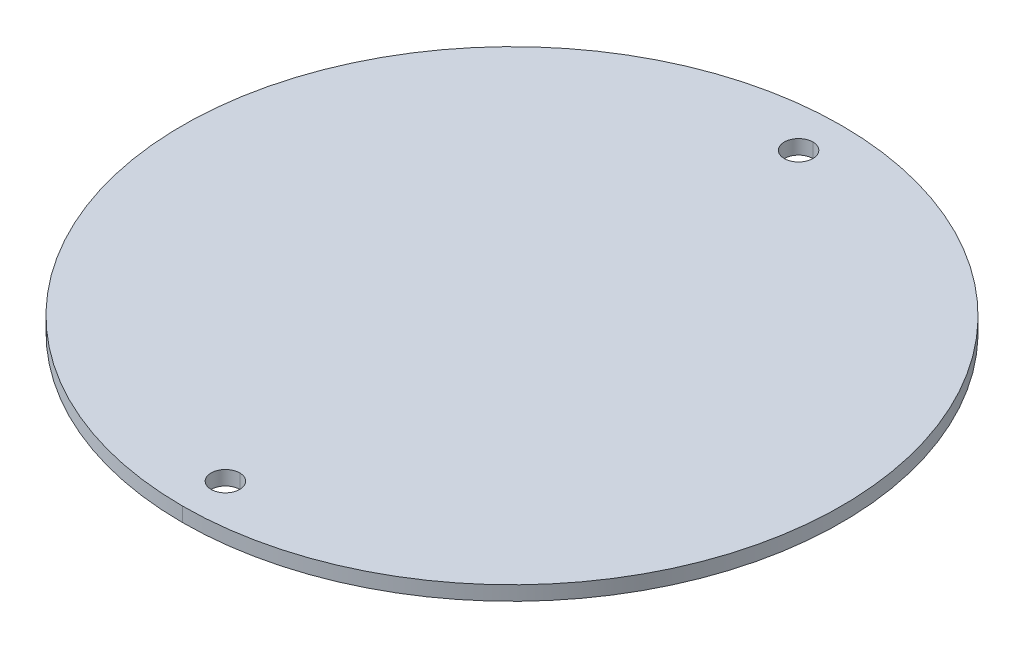
ISO-10303-21;
HEADER;
FILE_DESCRIPTION(('STEP AP214'),'2;1');
FILE_NAME('part.step','',(''),(''),'','','');
FILE_SCHEMA(('AUTOMOTIVE_DESIGN { 1 0 10303 214 1 1 1 1 }'));
ENDSEC;
DATA;
#1=APPLICATION_CONTEXT('core data for automotive mechanical design processes');
#2=APPLICATION_PROTOCOL_DEFINITION('international standard','automotive_design',2000,#1);
#3=PRODUCT_CONTEXT('',#1,'mechanical');
#4=PRODUCT('Part','Part','',(#3));
#5=PRODUCT_RELATED_PRODUCT_CATEGORY('part','',(#4));
#6=PRODUCT_DEFINITION_FORMATION('','',#4);
#7=PRODUCT_DEFINITION_CONTEXT('part definition',#1,'design');
#8=PRODUCT_DEFINITION('design','',#6,#7);
#9=PRODUCT_DEFINITION_SHAPE('','',#8);
#10=(LENGTH_UNIT() NAMED_UNIT(*) SI_UNIT(.MILLI.,.METRE.));
#11=(NAMED_UNIT(*) PLANE_ANGLE_UNIT() SI_UNIT($,.RADIAN.));
#12=(NAMED_UNIT(*) SI_UNIT($,.STERADIAN.) SOLID_ANGLE_UNIT());
#13=UNCERTAINTY_MEASURE_WITH_UNIT(LENGTH_MEASURE(1.E-05),#10,'distance_accuracy_value','');
#14=(GEOMETRIC_REPRESENTATION_CONTEXT(3) GLOBAL_UNCERTAINTY_ASSIGNED_CONTEXT((#13)) GLOBAL_UNIT_ASSIGNED_CONTEXT((#10,
#11,#12)) REPRESENTATION_CONTEXT('',''));
#15=CARTESIAN_POINT('',(0.,0.,0.));
#16=DIRECTION('',(0.,0.,1.));
#17=DIRECTION('',(1.,0.,0.));
#18=AXIS2_PLACEMENT_3D('',#15,#16,#17);
#19=CARTESIAN_POINT('',(0.,0.,63.5));
#20=DIRECTION('',(0.,1.,0.));
#21=DIRECTION('',(0.,0.,1.));
#22=AXIS2_PLACEMENT_3D('',#19,#20,#21);
#23=CYLINDRICAL_SURFACE('',#22,3.175);
#24=DIRECTION('',(0.,1.,0.));
#25=VECTOR('',#24,1.);
#26=CARTESIAN_POINT('',(0.,0.,60.325));
#27=LINE('',#26,#25);
#28=CARTESIAN_POINT('',(0.,0.,60.325));
#29=VERTEX_POINT('',#28);
#30=CARTESIAN_POINT('',(0.,3.175,60.325));
#31=VERTEX_POINT('',#30);
#32=EDGE_CURVE('E90',#29,#31,#27,.T.);
#33=ORIENTED_EDGE('',*,*,#32,.F.);
#34=CARTESIAN_POINT('',(0.,0.,63.5));
#35=DIRECTION('',(0.,1.,0.));
#36=DIRECTION('',(0.,0.,1.));
#37=AXIS2_PLACEMENT_3D('',#34,#35,#36);
#38=CIRCLE('',#37,3.175);
#39=CARTESIAN_POINT('',(0.,0.,66.675));
#40=VERTEX_POINT('',#39);
#41=EDGE_CURVE('E26',#40,#29,#38,.T.);
#42=ORIENTED_EDGE('',*,*,#41,.F.);
#43=DIRECTION('',(0.,1.,0.));
#44=VECTOR('',#43,1.);
#45=CARTESIAN_POINT('',(0.,0.,66.675));
#46=LINE('',#45,#44);
#47=CARTESIAN_POINT('',(0.,3.175,66.675));
#48=VERTEX_POINT('',#47);
#49=EDGE_CURVE('E93',#40,#48,#46,.T.);
#50=ORIENTED_EDGE('',*,*,#49,.T.);
#51=CARTESIAN_POINT('',(0.,3.175,63.5));
#52=DIRECTION('',(0.,1.,0.));
#53=DIRECTION('',(0.,0.,1.));
#54=AXIS2_PLACEMENT_3D('',#51,#52,#53);
#55=CIRCLE('',#54,3.175);
#56=EDGE_CURVE('E87',#48,#31,#55,.T.);
#57=ORIENTED_EDGE('',*,*,#56,.T.);
#58=EDGE_LOOP('',(#33,#42,#50,#57));
#59=FACE_BOUND('',#58,.T.);
#60=ADVANCED_FACE('F16',(#59),#23,.F.);
#61=CARTESIAN_POINT('',(4.43418130033078E-13,0.,-63.5));
#62=DIRECTION('',(0.,1.,0.));
#63=DIRECTION('',(0.,0.,1.));
#64=AXIS2_PLACEMENT_3D('',#61,#62,#63);
#65=CYLINDRICAL_SURFACE('',#64,3.175);
#66=DIRECTION('',(0.,1.,0.));
#67=VECTOR('',#66,1.);
#68=CARTESIAN_POINT('',(4.43806955391807E-13,0.,-66.675));
#69=LINE('',#68,#67);
#70=CARTESIAN_POINT('',(4.43806955391807E-13,0.,-66.675));
#71=VERTEX_POINT('',#70);
#72=CARTESIAN_POINT('',(4.43806955391807E-13,3.175,-66.675));
#73=VERTEX_POINT('',#72);
#74=EDGE_CURVE('E20',#71,#73,#69,.T.);
#75=ORIENTED_EDGE('',*,*,#74,.F.);
#76=CARTESIAN_POINT('',(4.43418130033078E-13,0.,-63.5));
#77=DIRECTION('',(0.,1.,0.));
#78=DIRECTION('',(0.,0.,1.));
#79=AXIS2_PLACEMENT_3D('',#76,#77,#78);
#80=CIRCLE('',#79,3.175);
#81=CARTESIAN_POINT('',(4.43418130033078E-13,0.,-60.325));
#82=VERTEX_POINT('',#81);
#83=EDGE_CURVE('E11',#82,#71,#80,.T.);
#84=ORIENTED_EDGE('',*,*,#83,.F.);
#85=DIRECTION('',(0.,1.,0.));
#86=VECTOR('',#85,1.);
#87=CARTESIAN_POINT('',(4.43418130033078E-13,0.,-60.325));
#88=LINE('',#87,#86);
#89=CARTESIAN_POINT('',(4.43418130033078E-13,3.175,-60.325));
#90=VERTEX_POINT('',#89);
#91=EDGE_CURVE('E117',#82,#90,#88,.T.);
#92=ORIENTED_EDGE('',*,*,#91,.T.);
#93=CARTESIAN_POINT('',(4.43418130033078E-13,3.175,-63.5));
#94=DIRECTION('',(0.,1.,0.));
#95=DIRECTION('',(0.,0.,1.));
#96=AXIS2_PLACEMENT_3D('',#93,#94,#95);
#97=CIRCLE('',#96,3.175);
#98=EDGE_CURVE('E97',#90,#73,#97,.T.);
#99=ORIENTED_EDGE('',*,*,#98,.T.);
#100=EDGE_LOOP('',(#75,#84,#92,#99));
#101=FACE_BOUND('',#100,.T.);
#102=ADVANCED_FACE('F184',(#101),#65,.F.);
#103=CARTESIAN_POINT('',(0.,0.,0.));
#104=DIRECTION('',(0.,1.,0.));
#105=DIRECTION('',(1.,0.,0.));
#106=AXIS2_PLACEMENT_3D('',#103,#104,#105);
#107=PLANE('',#106);
#108=ORIENTED_EDGE('',*,*,#83,.T.);
#109=CARTESIAN_POINT('',(4.43418130033078E-13,0.,-63.5));
#110=DIRECTION('',(0.,1.,0.));
#111=DIRECTION('',(0.,0.,1.));
#112=AXIS2_PLACEMENT_3D('',#109,#110,#111);
#113=CIRCLE('',#112,3.175);
#114=EDGE_CURVE('E116',#71,#82,#113,.T.);
#115=ORIENTED_EDGE('',*,*,#114,.T.);
#116=EDGE_LOOP('',(#108,#115));
#117=FACE_BOUND('',#116,.T.);
#118=ORIENTED_EDGE('',*,*,#41,.T.);
#119=CARTESIAN_POINT('',(0.,0.,63.5));
#120=DIRECTION('',(0.,1.,0.));
#121=DIRECTION('',(0.,0.,1.));
#122=AXIS2_PLACEMENT_3D('',#119,#120,#121);
#123=CIRCLE('',#122,3.175);
#124=EDGE_CURVE('E106',#29,#40,#123,.T.);
#125=ORIENTED_EDGE('',*,*,#124,.T.);
#126=EDGE_LOOP('',(#118,#125));
#127=FACE_BOUND('',#126,.T.);
#128=CARTESIAN_POINT('',(0.,0.,0.));
#129=DIRECTION('',(0.,1.,0.));
#130=DIRECTION('',(0.,0.,1.));
#131=AXIS2_PLACEMENT_3D('',#128,#129,#130);
#132=CIRCLE('',#131,73.025);
#133=CARTESIAN_POINT('',(0.,0.,-73.025));
#134=VERTEX_POINT('',#133);
#135=CARTESIAN_POINT('',(0.,0.,73.025));
#136=VERTEX_POINT('',#135);
#137=EDGE_CURVE('E39',#134,#136,#132,.T.);
#138=ORIENTED_EDGE('',*,*,#137,.F.);
#139=CARTESIAN_POINT('',(0.,0.,0.));
#140=DIRECTION('',(0.,1.,0.));
#141=DIRECTION('',(0.,0.,1.));
#142=AXIS2_PLACEMENT_3D('',#139,#140,#141);
#143=CIRCLE('',#142,73.025);
#144=EDGE_CURVE('E127',#136,#134,#143,.T.);
#145=ORIENTED_EDGE('',*,*,#144,.F.);
#146=EDGE_LOOP('',(#138,#145));
#147=FACE_BOUND('',#146,.T.);
#148=ADVANCED_FACE('F175',(#117,#127,#147),#107,.F.);
#149=CARTESIAN_POINT('',(0.,3.175,0.));
#150=DIRECTION('',(0.,1.,0.));
#151=DIRECTION('',(1.,0.,0.));
#152=AXIS2_PLACEMENT_3D('',#149,#150,#151);
#153=PLANE('',#152);
#154=ORIENTED_EDGE('',*,*,#98,.F.);
#155=CARTESIAN_POINT('',(4.43418130033078E-13,3.175,-63.5));
#156=DIRECTION('',(0.,1.,0.));
#157=DIRECTION('',(0.,0.,1.));
#158=AXIS2_PLACEMENT_3D('',#155,#156,#157);
#159=CIRCLE('',#158,3.175);
#160=EDGE_CURVE('E121',#73,#90,#159,.T.);
#161=ORIENTED_EDGE('',*,*,#160,.F.);
#162=EDGE_LOOP('',(#154,#161));
#163=FACE_BOUND('',#162,.T.);
#164=ORIENTED_EDGE('',*,*,#56,.F.);
#165=CARTESIAN_POINT('',(0.,3.175,63.5));
#166=DIRECTION('',(0.,1.,0.));
#167=DIRECTION('',(0.,0.,1.));
#168=AXIS2_PLACEMENT_3D('',#165,#166,#167);
#169=CIRCLE('',#168,3.175);
#170=EDGE_CURVE('E98',#31,#48,#169,.T.);
#171=ORIENTED_EDGE('',*,*,#170,.F.);
#172=EDGE_LOOP('',(#164,#171));
#173=FACE_BOUND('',#172,.T.);
#174=CARTESIAN_POINT('',(0.,3.175,0.));
#175=DIRECTION('',(0.,1.,0.));
#176=DIRECTION('',(0.,0.,1.));
#177=AXIS2_PLACEMENT_3D('',#174,#175,#176);
#178=CIRCLE('',#177,73.025);
#179=CARTESIAN_POINT('',(0.,3.175,-73.025));
#180=VERTEX_POINT('',#179);
#181=CARTESIAN_POINT('',(0.,3.175,73.025));
#182=VERTEX_POINT('',#181);
#183=EDGE_CURVE('E123',#180,#182,#178,.T.);
#184=ORIENTED_EDGE('',*,*,#183,.T.);
#185=CARTESIAN_POINT('',(0.,3.175,0.));
#186=DIRECTION('',(0.,1.,0.));
#187=DIRECTION('',(0.,0.,1.));
#188=AXIS2_PLACEMENT_3D('',#185,#186,#187);
#189=CIRCLE('',#188,73.025);
#190=EDGE_CURVE('E120',#182,#180,#189,.T.);
#191=ORIENTED_EDGE('',*,*,#190,.T.);
#192=EDGE_LOOP('',(#184,#191));
#193=FACE_BOUND('',#192,.T.);
#194=ADVANCED_FACE('F99',(#163,#173,#193),#153,.T.);
#195=CARTESIAN_POINT('',(0.,3.175,0.));
#196=DIRECTION('',(0.,-1.,0.));
#197=DIRECTION('',(0.,0.,-1.));
#198=AXIS2_PLACEMENT_3D('',#195,#196,#197);
#199=CYLINDRICAL_SURFACE('',#198,73.025);
#200=DIRECTION('',(0.,-1.,0.));
#201=VECTOR('',#200,1.);
#202=CARTESIAN_POINT('',(0.,3.175,73.025));
#203=LINE('',#202,#201);
#204=EDGE_CURVE('E131',#182,#136,#203,.T.);
#205=ORIENTED_EDGE('',*,*,#204,.F.);
#206=ORIENTED_EDGE('',*,*,#183,.F.);
#207=DIRECTION('',(0.,-1.,0.));
#208=VECTOR('',#207,1.);
#209=CARTESIAN_POINT('',(0.,3.175,-73.025));
#210=LINE('',#209,#208);
#211=EDGE_CURVE('E126',#180,#134,#210,.T.);
#212=ORIENTED_EDGE('',*,*,#211,.T.);
#213=ORIENTED_EDGE('',*,*,#137,.T.);
#214=EDGE_LOOP('',(#205,#206,#212,#213));
#215=FACE_BOUND('',#214,.T.);
#216=ADVANCED_FACE('F173',(#215),#199,.T.);
#217=CARTESIAN_POINT('',(0.,3.175,0.));
#218=DIRECTION('',(0.,-1.,0.));
#219=DIRECTION('',(0.,0.,-1.));
#220=AXIS2_PLACEMENT_3D('',#217,#218,#219);
#221=CYLINDRICAL_SURFACE('',#220,73.025);
#222=ORIENTED_EDGE('',*,*,#190,.F.);
#223=ORIENTED_EDGE('',*,*,#204,.T.);
#224=ORIENTED_EDGE('',*,*,#144,.T.);
#225=ORIENTED_EDGE('',*,*,#211,.F.);
#226=EDGE_LOOP('',(#222,#223,#224,#225));
#227=FACE_BOUND('',#226,.T.);
#228=ADVANCED_FACE('F171',(#227),#221,.T.);
#229=CARTESIAN_POINT('',(4.43418130033078E-13,0.,-63.5));
#230=DIRECTION('',(0.,1.,0.));
#231=DIRECTION('',(0.,0.,1.));
#232=AXIS2_PLACEMENT_3D('',#229,#230,#231);
#233=CYLINDRICAL_SURFACE('',#232,3.175);
#234=ORIENTED_EDGE('',*,*,#114,.F.);
#235=ORIENTED_EDGE('',*,*,#74,.T.);
#236=ORIENTED_EDGE('',*,*,#160,.T.);
#237=ORIENTED_EDGE('',*,*,#91,.F.);
#238=EDGE_LOOP('',(#234,#235,#236,#237));
#239=FACE_BOUND('',#238,.T.);
#240=ADVANCED_FACE('F18',(#239),#233,.F.);
#241=CARTESIAN_POINT('',(0.,0.,63.5));
#242=DIRECTION('',(0.,1.,0.));
#243=DIRECTION('',(0.,0.,1.));
#244=AXIS2_PLACEMENT_3D('',#241,#242,#243);
#245=CYLINDRICAL_SURFACE('',#244,3.175);
#246=ORIENTED_EDGE('',*,*,#124,.F.);
#247=ORIENTED_EDGE('',*,*,#32,.T.);
#248=ORIENTED_EDGE('',*,*,#170,.T.);
#249=ORIENTED_EDGE('',*,*,#49,.F.);
#250=EDGE_LOOP('',(#246,#247,#248,#249));
#251=FACE_BOUND('',#250,.T.);
#252=ADVANCED_FACE('F104',(#251),#245,.F.);
#253=CLOSED_SHELL('',(#60,#102,#148,#194,#216,#228,#240,#252));
#254=MANIFOLD_SOLID_BREP('B1',#253);
#255=ADVANCED_BREP_SHAPE_REPRESENTATION('',(#18,#254),#14);
#256=SHAPE_DEFINITION_REPRESENTATION(#9,#255);
ENDSEC;
END-ISO-10303-21;
